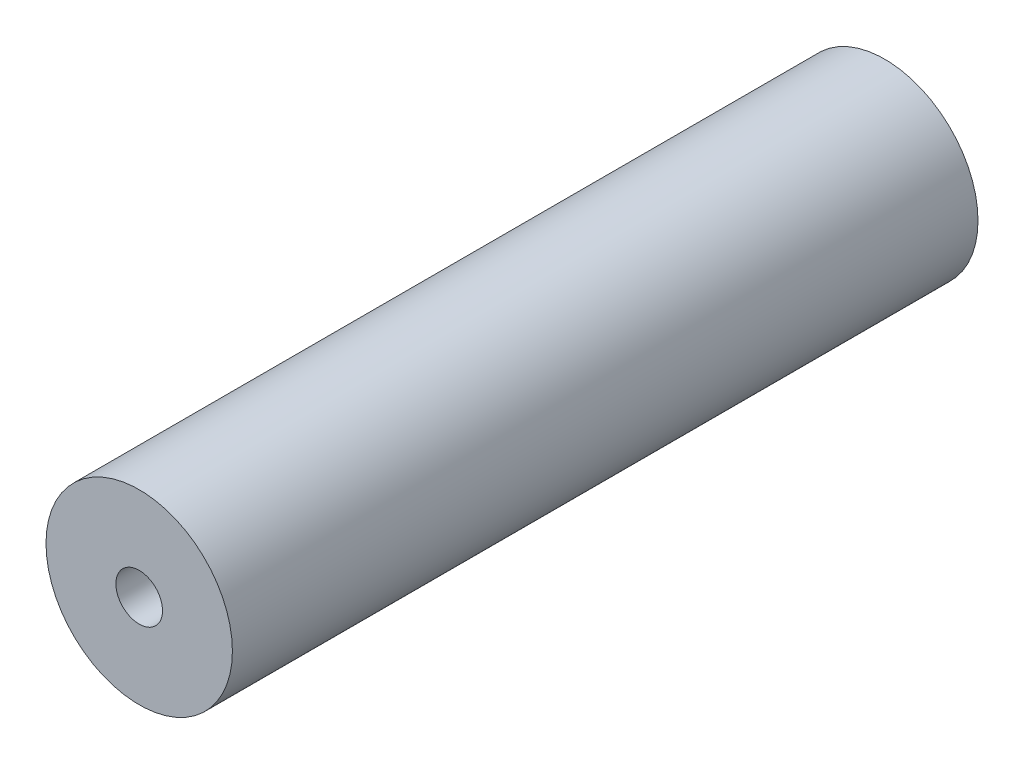
ISO-10303-21;
HEADER;
FILE_DESCRIPTION(('STEP AP214'),'2;1');
FILE_NAME('part.step','',(''),(''),'','','');
FILE_SCHEMA(('AUTOMOTIVE_DESIGN { 1 0 10303 214 1 1 1 1 }'));
ENDSEC;
DATA;
#1=APPLICATION_CONTEXT('core data for automotive mechanical design processes');
#2=APPLICATION_PROTOCOL_DEFINITION('international standard','automotive_design',2000,#1);
#3=PRODUCT_CONTEXT('',#1,'mechanical');
#4=PRODUCT('Part','Part','',(#3));
#5=PRODUCT_RELATED_PRODUCT_CATEGORY('part','',(#4));
#6=PRODUCT_DEFINITION_FORMATION('','',#4);
#7=PRODUCT_DEFINITION_CONTEXT('part definition',#1,'design');
#8=PRODUCT_DEFINITION('design','',#6,#7);
#9=PRODUCT_DEFINITION_SHAPE('','',#8);
#10=(LENGTH_UNIT() NAMED_UNIT(*) SI_UNIT(.MILLI.,.METRE.));
#11=(NAMED_UNIT(*) PLANE_ANGLE_UNIT() SI_UNIT($,.RADIAN.));
#12=(NAMED_UNIT(*) SI_UNIT($,.STERADIAN.) SOLID_ANGLE_UNIT());
#13=UNCERTAINTY_MEASURE_WITH_UNIT(LENGTH_MEASURE(1.E-05),#10,'distance_accuracy_value','');
#14=(GEOMETRIC_REPRESENTATION_CONTEXT(3) GLOBAL_UNCERTAINTY_ASSIGNED_CONTEXT((#13)) GLOBAL_UNIT_ASSIGNED_CONTEXT((#10,
#11,#12)) REPRESENTATION_CONTEXT('',''));
#15=CARTESIAN_POINT('',(0.,0.,0.));
#16=DIRECTION('',(0.,0.,1.));
#17=DIRECTION('',(1.,0.,0.));
#18=AXIS2_PLACEMENT_3D('',#15,#16,#17);
#19=CARTESIAN_POINT('',(0.,0.,203.2));
#20=DIRECTION('',(0.,0.,-1.));
#21=DIRECTION('',(-1.,0.,0.));
#22=AXIS2_PLACEMENT_3D('',#19,#20,#21);
#23=CYLINDRICAL_SURFACE('',#22,25.4);
#24=CARTESIAN_POINT('',(0.,0.,203.2));
#25=DIRECTION('',(0.,0.,1.));
#26=DIRECTION('',(1.,0.,0.));
#27=AXIS2_PLACEMENT_3D('',#24,#25,#26);
#28=CIRCLE('',#27,25.4);
#29=CARTESIAN_POINT('',(25.4,0.,203.2));
#30=VERTEX_POINT('',#29);
#31=EDGE_CURVE('E10',#30,#30,#28,.T.);
#32=ORIENTED_EDGE('',*,*,#31,.F.);
#33=EDGE_LOOP('',(#32));
#34=FACE_BOUND('',#33,.T.);
#35=CARTESIAN_POINT('',(0.,0.,0.));
#36=DIRECTION('',(0.,0.,1.));
#37=DIRECTION('',(1.,0.,0.));
#38=AXIS2_PLACEMENT_3D('',#35,#36,#37);
#39=CIRCLE('',#38,25.4);
#40=CARTESIAN_POINT('',(25.4,0.,0.));
#41=VERTEX_POINT('',#40);
#42=EDGE_CURVE('E34',#41,#41,#39,.T.);
#43=ORIENTED_EDGE('',*,*,#42,.T.);
#44=EDGE_LOOP('',(#43));
#45=FACE_BOUND('',#44,.T.);
#46=ADVANCED_FACE('F31',(#34,#45),#23,.T.);
#47=CARTESIAN_POINT('',(0.,0.,203.2));
#48=DIRECTION('',(0.,0.,1.));
#49=DIRECTION('',(1.,0.,0.));
#50=AXIS2_PLACEMENT_3D('',#47,#48,#49);
#51=PLANE('',#50);
#52=CARTESIAN_POINT('',(0.,0.,203.2));
#53=DIRECTION('',(0.,0.,1.));
#54=DIRECTION('',(1.,0.,0.));
#55=AXIS2_PLACEMENT_3D('',#52,#53,#54);
#56=CIRCLE('',#55,6.35);
#57=CARTESIAN_POINT('',(6.35,0.,203.2));
#58=VERTEX_POINT('',#57);
#59=EDGE_CURVE('E43',#58,#58,#56,.T.);
#60=ORIENTED_EDGE('',*,*,#59,.F.);
#61=EDGE_LOOP('',(#60));
#62=FACE_BOUND('',#61,.T.);
#63=ORIENTED_EDGE('',*,*,#31,.T.);
#64=EDGE_LOOP('',(#63));
#65=FACE_BOUND('',#64,.T.);
#66=ADVANCED_FACE('F58',(#62,#65),#51,.T.);
#67=CARTESIAN_POINT('',(0.,0.,0.));
#68=DIRECTION('',(0.,0.,1.));
#69=DIRECTION('',(1.,0.,0.));
#70=AXIS2_PLACEMENT_3D('',#67,#68,#69);
#71=PLANE('',#70);
#72=CARTESIAN_POINT('',(0.,0.,0.));
#73=DIRECTION('',(0.,0.,1.));
#74=DIRECTION('',(1.,0.,0.));
#75=AXIS2_PLACEMENT_3D('',#72,#73,#74);
#76=CIRCLE('',#75,6.35);
#77=CARTESIAN_POINT('',(6.35,0.,0.));
#78=VERTEX_POINT('',#77);
#79=EDGE_CURVE('E41',#78,#78,#76,.T.);
#80=ORIENTED_EDGE('',*,*,#79,.T.);
#81=EDGE_LOOP('',(#80));
#82=FACE_BOUND('',#81,.T.);
#83=ORIENTED_EDGE('',*,*,#42,.F.);
#84=EDGE_LOOP('',(#83));
#85=FACE_BOUND('',#84,.T.);
#86=ADVANCED_FACE('F49',(#82,#85),#71,.F.);
#87=CARTESIAN_POINT('',(0.,0.,0.));
#88=DIRECTION('',(0.,0.,1.));
#89=DIRECTION('',(1.,0.,0.));
#90=AXIS2_PLACEMENT_3D('',#87,#88,#89);
#91=CYLINDRICAL_SURFACE('',#90,6.35);
#92=ORIENTED_EDGE('',*,*,#79,.F.);
#93=EDGE_LOOP('',(#92));
#94=FACE_BOUND('',#93,.T.);
#95=ORIENTED_EDGE('',*,*,#59,.T.);
#96=EDGE_LOOP('',(#95));
#97=FACE_BOUND('',#96,.T.);
#98=ADVANCED_FACE('F52',(#94,#97),#91,.F.);
#99=CLOSED_SHELL('',(#46,#66,#86,#98));
#100=MANIFOLD_SOLID_BREP('B2',#99);
#101=ADVANCED_BREP_SHAPE_REPRESENTATION('',(#18,#100),#14);
#102=SHAPE_DEFINITION_REPRESENTATION(#9,#101);
ENDSEC;
END-ISO-10303-21;
